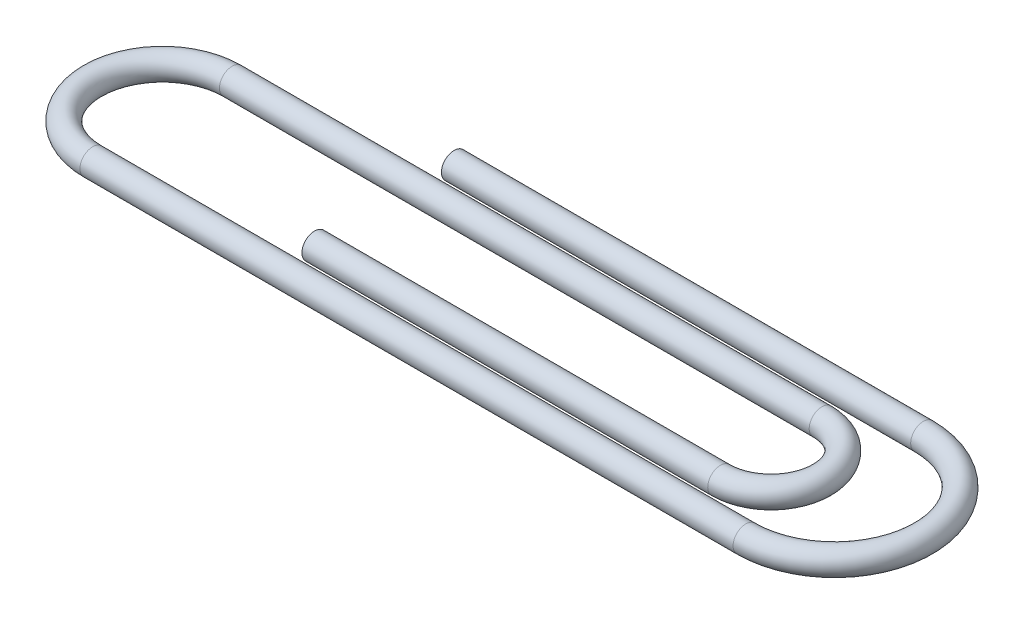
ISO-10303-21;
HEADER;
FILE_DESCRIPTION(('STEP AP214'),'2;1');
FILE_NAME('part.step','',(''),(''),'','','');
FILE_SCHEMA(('AUTOMOTIVE_DESIGN { 1 0 10303 214 1 1 1 1 }'));
ENDSEC;
DATA;
#1=APPLICATION_CONTEXT('core data for automotive mechanical design processes');
#2=APPLICATION_PROTOCOL_DEFINITION('international standard','automotive_design',2000,#1);
#3=PRODUCT_CONTEXT('',#1,'mechanical');
#4=PRODUCT('Part','Part','',(#3));
#5=PRODUCT_RELATED_PRODUCT_CATEGORY('part','',(#4));
#6=PRODUCT_DEFINITION_FORMATION('','',#4);
#7=PRODUCT_DEFINITION_CONTEXT('part definition',#1,'design');
#8=PRODUCT_DEFINITION('design','',#6,#7);
#9=PRODUCT_DEFINITION_SHAPE('','',#8);
#10=(LENGTH_UNIT() NAMED_UNIT(*) SI_UNIT(.MILLI.,.METRE.));
#11=(NAMED_UNIT(*) PLANE_ANGLE_UNIT() SI_UNIT($,.RADIAN.));
#12=(NAMED_UNIT(*) SI_UNIT($,.STERADIAN.) SOLID_ANGLE_UNIT());
#13=UNCERTAINTY_MEASURE_WITH_UNIT(LENGTH_MEASURE(1.E-05),#10,'distance_accuracy_value','');
#14=(GEOMETRIC_REPRESENTATION_CONTEXT(3) GLOBAL_UNCERTAINTY_ASSIGNED_CONTEXT((#13)) GLOBAL_UNIT_ASSIGNED_CONTEXT((#10,
#11,#12)) REPRESENTATION_CONTEXT('',''));
#15=CARTESIAN_POINT('',(0.,0.,0.));
#16=DIRECTION('',(0.,0.,1.));
#17=DIRECTION('',(1.,0.,0.));
#18=AXIS2_PLACEMENT_3D('',#15,#16,#17);
#19=CARTESIAN_POINT('',(0.,0.,0.));
#20=DIRECTION('',(1.,0.,0.));
#21=DIRECTION('',(0.,0.,-1.));
#22=AXIS2_PLACEMENT_3D('',#19,#20,#21);
#23=PLANE('',#22);
#24=CARTESIAN_POINT('',(0.,0.,0.));
#25=DIRECTION('',(1.,0.,0.));
#26=DIRECTION('',(0.,0.,-1.));
#27=AXIS2_PLACEMENT_3D('',#24,#25,#26);
#28=CIRCLE('',#27,0.5);
#29=CARTESIAN_POINT('',(0.,0.,-0.5));
#30=VERTEX_POINT('',#29);
#31=EDGE_CURVE('E59',#30,#30,#28,.T.);
#32=ORIENTED_EDGE('',*,*,#31,.F.);
#33=EDGE_LOOP('',(#32));
#34=FACE_BOUND('',#33,.T.);
#35=ADVANCED_FACE('F31',(#34),#23,.F.);
#36=CARTESIAN_POINT('',(0.,0.,5.5));
#37=DIRECTION('',(-1.,0.,0.));
#38=DIRECTION('',(0.,0.,1.));
#39=AXIS2_PLACEMENT_3D('',#36,#37,#38);
#40=PLANE('',#39);
#41=CARTESIAN_POINT('',(0.,0.,5.5));
#42=DIRECTION('',(-1.,0.,0.));
#43=DIRECTION('',(0.,0.,1.));
#44=AXIS2_PLACEMENT_3D('',#41,#42,#43);
#45=CIRCLE('',#44,0.5);
#46=CARTESIAN_POINT('',(0.,0.,6.));
#47=VERTEX_POINT('',#46);
#48=EDGE_CURVE('E10',#47,#47,#45,.T.);
#49=ORIENTED_EDGE('',*,*,#48,.T.);
#50=EDGE_LOOP('',(#49));
#51=FACE_BOUND('',#50,.T.);
#52=ADVANCED_FACE('F66',(#51),#40,.T.);
#53=CARTESIAN_POINT('',(0.,0.,0.));
#54=DIRECTION('',(1.,0.,0.));
#55=DIRECTION('',(0.,0.,-1.));
#56=AXIS2_PLACEMENT_3D('',#53,#54,#55);
#57=CYLINDRICAL_SURFACE('',#56,0.5);
#58=CARTESIAN_POINT('',(18.5,0.,0.));
#59=DIRECTION('',(1.,0.,0.));
#60=DIRECTION('',(0.,0.,-1.));
#61=AXIS2_PLACEMENT_3D('',#58,#59,#60);
#62=CIRCLE('',#61,0.5);
#63=CARTESIAN_POINT('',(18.5,0.,-0.5));
#64=VERTEX_POINT('',#63);
#65=EDGE_CURVE('E56',#64,#64,#62,.T.);
#66=ORIENTED_EDGE('',*,*,#65,.F.);
#67=EDGE_LOOP('',(#66));
#68=FACE_BOUND('',#67,.T.);
#69=ORIENTED_EDGE('',*,*,#31,.T.);
#70=EDGE_LOOP('',(#69));
#71=FACE_BOUND('',#70,.T.);
#72=ADVANCED_FACE('F63',(#68,#71),#57,.T.);
#73=CARTESIAN_POINT('',(18.5,0.,3.5));
#74=DIRECTION('',(0.,-1.,0.));
#75=DIRECTION('',(0.,0.,-1.));
#76=AXIS2_PLACEMENT_3D('',#73,#74,#75);
#77=TOROIDAL_SURFACE('',#76,3.5,0.5);
#78=CARTESIAN_POINT('',(18.5,0.,7.));
#79=DIRECTION('',(-1.,0.,0.));
#80=DIRECTION('',(0.,0.,1.));
#81=AXIS2_PLACEMENT_3D('',#78,#79,#80);
#82=CIRCLE('',#81,0.5);
#83=CARTESIAN_POINT('',(18.5,0.,7.5));
#84=VERTEX_POINT('',#83);
#85=EDGE_CURVE('E53',#84,#84,#82,.T.);
#86=CARTESIAN_POINT('',(18.5,0.,3.5));
#87=DIRECTION('',(0.,-1.,0.));
#88=DIRECTION('',(0.,0.,-1.));
#89=AXIS2_PLACEMENT_3D('',#86,#87,#88);
#90=CIRCLE('',#89,4.);
#91=EDGE_CURVE('',#64,#84,#90,.T.);
#92=ORIENTED_EDGE('',*,*,#65,.T.);
#93=ORIENTED_EDGE('',*,*,#85,.F.);
#94=ORIENTED_EDGE('',*,*,#91,.T.);
#95=ORIENTED_EDGE('',*,*,#91,.F.);
#96=EDGE_LOOP('',(#92,#94,#93,#95));
#97=FACE_BOUND('',#96,.T.);
#98=ADVANCED_FACE('F92',(#97),#77,.T.);
#99=CARTESIAN_POINT('',(18.5,0.,7.));
#100=DIRECTION('',(-1.,0.,0.));
#101=DIRECTION('',(0.,0.,1.));
#102=AXIS2_PLACEMENT_3D('',#99,#100,#101);
#103=CYLINDRICAL_SURFACE('',#102,0.5);
#104=CARTESIAN_POINT('',(-7.25000000000001,0.,7.));
#105=DIRECTION('',(-1.,0.,0.));
#106=DIRECTION('',(0.,0.,1.));
#107=AXIS2_PLACEMENT_3D('',#104,#105,#106);
#108=CIRCLE('',#107,0.5);
#109=CARTESIAN_POINT('',(-7.25000000000001,0.,7.5));
#110=VERTEX_POINT('',#109);
#111=EDGE_CURVE('E50',#110,#110,#108,.T.);
#112=ORIENTED_EDGE('',*,*,#111,.F.);
#113=EDGE_LOOP('',(#112));
#114=FACE_BOUND('',#113,.T.);
#115=ORIENTED_EDGE('',*,*,#85,.T.);
#116=EDGE_LOOP('',(#115));
#117=FACE_BOUND('',#116,.T.);
#118=ADVANCED_FACE('F88',(#114,#117),#103,.T.);
#119=CARTESIAN_POINT('',(-7.25000000000002,0.,4.25));
#120=DIRECTION('',(0.,-1.,0.));
#121=DIRECTION('',(0.,0.,-1.));
#122=AXIS2_PLACEMENT_3D('',#119,#120,#121);
#123=TOROIDAL_SURFACE('',#122,2.75,0.5);
#124=CARTESIAN_POINT('',(-7.25000000000002,0.,1.5));
#125=DIRECTION('',(1.,0.,0.));
#126=DIRECTION('',(0.,0.,-1.));
#127=AXIS2_PLACEMENT_3D('',#124,#125,#126);
#128=CIRCLE('',#127,0.5);
#129=CARTESIAN_POINT('',(-7.25000000000002,0.,1.));
#130=VERTEX_POINT('',#129);
#131=EDGE_CURVE('E45',#130,#130,#128,.T.);
#132=CARTESIAN_POINT('',(-7.25000000000002,0.,4.25));
#133=DIRECTION('',(0.,-1.,0.));
#134=DIRECTION('',(0.,0.,-1.));
#135=AXIS2_PLACEMENT_3D('',#132,#133,#134);
#136=CIRCLE('',#135,3.25);
#137=EDGE_CURVE('',#110,#130,#136,.T.);
#138=ORIENTED_EDGE('',*,*,#111,.T.);
#139=ORIENTED_EDGE('',*,*,#131,.F.);
#140=ORIENTED_EDGE('',*,*,#137,.T.);
#141=ORIENTED_EDGE('',*,*,#137,.F.);
#142=EDGE_LOOP('',(#138,#140,#139,#141));
#143=FACE_BOUND('',#142,.T.);
#144=ADVANCED_FACE('F84',(#143),#123,.T.);
#145=CARTESIAN_POINT('',(-7.25000000000002,0.,1.5));
#146=DIRECTION('',(1.,0.,0.));
#147=DIRECTION('',(0.,0.,-1.));
#148=AXIS2_PLACEMENT_3D('',#145,#146,#147);
#149=CYLINDRICAL_SURFACE('',#148,0.5);
#150=CARTESIAN_POINT('',(16.,0.,1.5));
#151=DIRECTION('',(1.,0.,0.));
#152=DIRECTION('',(0.,0.,-1.));
#153=AXIS2_PLACEMENT_3D('',#150,#151,#152);
#154=CIRCLE('',#153,0.5);
#155=CARTESIAN_POINT('',(16.,0.,0.999999999999996));
#156=VERTEX_POINT('',#155);
#157=EDGE_CURVE('E41',#156,#156,#154,.T.);
#158=ORIENTED_EDGE('',*,*,#157,.F.);
#159=EDGE_LOOP('',(#158));
#160=FACE_BOUND('',#159,.T.);
#161=ORIENTED_EDGE('',*,*,#131,.T.);
#162=EDGE_LOOP('',(#161));
#163=FACE_BOUND('',#162,.T.);
#164=ADVANCED_FACE('F78',(#160,#163),#149,.T.);
#165=CARTESIAN_POINT('',(16.,0.,3.5));
#166=DIRECTION('',(0.,-1.,0.));
#167=DIRECTION('',(0.,0.,-1.));
#168=AXIS2_PLACEMENT_3D('',#165,#166,#167);
#169=TOROIDAL_SURFACE('',#168,2.,0.5);
#170=CARTESIAN_POINT('',(16.,0.,5.5));
#171=DIRECTION('',(-1.,0.,0.));
#172=DIRECTION('',(0.,0.,1.));
#173=AXIS2_PLACEMENT_3D('',#170,#171,#172);
#174=CIRCLE('',#173,0.5);
#175=CARTESIAN_POINT('',(16.,0.,6.));
#176=VERTEX_POINT('',#175);
#177=EDGE_CURVE('E37',#176,#176,#174,.T.);
#178=CARTESIAN_POINT('',(16.,0.,3.5));
#179=DIRECTION('',(0.,-1.,0.));
#180=DIRECTION('',(0.,0.,-1.));
#181=AXIS2_PLACEMENT_3D('',#178,#179,#180);
#182=CIRCLE('',#181,2.5);
#183=EDGE_CURVE('',#156,#176,#182,.T.);
#184=ORIENTED_EDGE('',*,*,#157,.T.);
#185=ORIENTED_EDGE('',*,*,#177,.F.);
#186=ORIENTED_EDGE('',*,*,#183,.T.);
#187=ORIENTED_EDGE('',*,*,#183,.F.);
#188=EDGE_LOOP('',(#184,#186,#185,#187));
#189=FACE_BOUND('',#188,.T.);
#190=ADVANCED_FACE('F72',(#189),#169,.T.);
#191=CARTESIAN_POINT('',(16.,0.,5.5));
#192=DIRECTION('',(-1.,0.,0.));
#193=DIRECTION('',(0.,0.,1.));
#194=AXIS2_PLACEMENT_3D('',#191,#192,#193);
#195=CYLINDRICAL_SURFACE('',#194,0.5);
#196=ORIENTED_EDGE('',*,*,#48,.F.);
#197=EDGE_LOOP('',(#196));
#198=FACE_BOUND('',#197,.T.);
#199=ORIENTED_EDGE('',*,*,#177,.T.);
#200=EDGE_LOOP('',(#199));
#201=FACE_BOUND('',#200,.T.);
#202=ADVANCED_FACE('F70',(#198,#201),#195,.T.);
#203=CLOSED_SHELL('',(#35,#52,#72,#98,#118,#144,#164,#190,#202));
#204=MANIFOLD_SOLID_BREP('B2',#203);
#205=ADVANCED_BREP_SHAPE_REPRESENTATION('',(#18,#204),#14);
#206=SHAPE_DEFINITION_REPRESENTATION(#9,#205);
ENDSEC;
END-ISO-10303-21;
